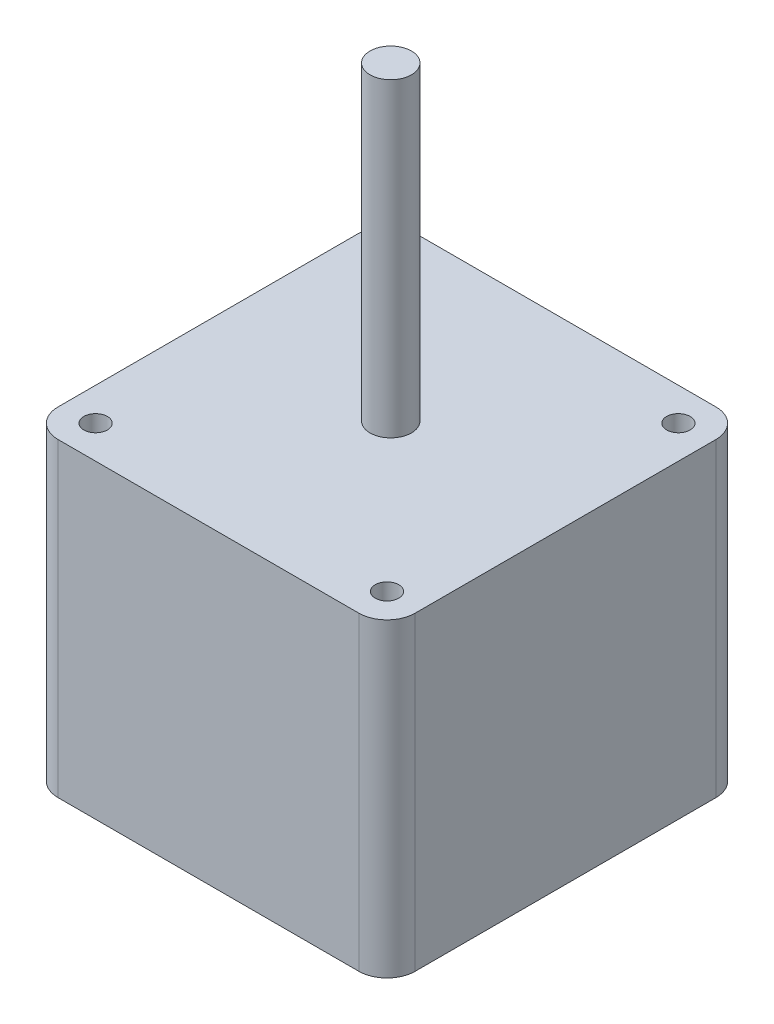
ISO-10303-21;
HEADER;
FILE_DESCRIPTION(('STEP AP214'),'2;1');
FILE_NAME('part.step','',(''),(''),'','','');
FILE_SCHEMA(('AUTOMOTIVE_DESIGN { 1 0 10303 214 1 1 1 1 }'));
ENDSEC;
DATA;
#1=APPLICATION_CONTEXT('core data for automotive mechanical design processes');
#2=APPLICATION_PROTOCOL_DEFINITION('international standard','automotive_design',2000,#1);
#3=PRODUCT_CONTEXT('',#1,'mechanical');
#4=PRODUCT('Part','Part','',(#3));
#5=PRODUCT_RELATED_PRODUCT_CATEGORY('part','',(#4));
#6=PRODUCT_DEFINITION_FORMATION('','',#4);
#7=PRODUCT_DEFINITION_CONTEXT('part definition',#1,'design');
#8=PRODUCT_DEFINITION('design','',#6,#7);
#9=PRODUCT_DEFINITION_SHAPE('','',#8);
#10=(LENGTH_UNIT() NAMED_UNIT(*) SI_UNIT(.MILLI.,.METRE.));
#11=(NAMED_UNIT(*) PLANE_ANGLE_UNIT() SI_UNIT($,.RADIAN.));
#12=(NAMED_UNIT(*) SI_UNIT($,.STERADIAN.) SOLID_ANGLE_UNIT());
#13=UNCERTAINTY_MEASURE_WITH_UNIT(LENGTH_MEASURE(1.E-05),#10,'distance_accuracy_value','');
#14=(GEOMETRIC_REPRESENTATION_CONTEXT(3) GLOBAL_UNCERTAINTY_ASSIGNED_CONTEXT((#13)) GLOBAL_UNIT_ASSIGNED_CONTEXT((#10,
#11,#12)) REPRESENTATION_CONTEXT('',''));
#15=CARTESIAN_POINT('',(0.,0.,0.));
#16=DIRECTION('',(0.,0.,1.));
#17=DIRECTION('',(1.,0.,0.));
#18=AXIS2_PLACEMENT_3D('',#15,#16,#17);
#19=CARTESIAN_POINT('',(0.,33.,0.));
#20=DIRECTION('',(0.,1.,0.));
#21=DIRECTION('',(0.,0.,1.));
#22=AXIS2_PLACEMENT_3D('',#19,#20,#21);
#23=PLANE('',#22);
#24=CARTESIAN_POINT('',(3.50000000000002,33.,-3.49999999999999));
#25=DIRECTION('',(0.,-1.,0.));
#26=DIRECTION('',(0.,0.,-1.));
#27=AXIS2_PLACEMENT_3D('',#24,#25,#26);
#28=CIRCLE('',#27,1.25);
#29=CARTESIAN_POINT('',(3.50000000000002,33.,-2.24999999999999));
#30=VERTEX_POINT('',#29);
#31=EDGE_CURVE('E198',#30,#30,#28,.T.);
#32=ORIENTED_EDGE('',*,*,#31,.T.);
#33=EDGE_LOOP('',(#32));
#34=FACE_BOUND('',#33,.T.);
#35=CARTESIAN_POINT('',(34.5,33.,-3.49999999999996));
#36=DIRECTION('',(0.,1.,0.));
#37=DIRECTION('',(0.,0.,1.));
#38=AXIS2_PLACEMENT_3D('',#35,#36,#37);
#39=CIRCLE('',#38,1.25);
#40=CARTESIAN_POINT('',(34.5,33.,-2.24999999999996));
#41=VERTEX_POINT('',#40);
#42=EDGE_CURVE('E199',#41,#41,#39,.T.);
#43=ORIENTED_EDGE('',*,*,#42,.F.);
#44=EDGE_LOOP('',(#43));
#45=FACE_BOUND('',#44,.T.);
#46=CARTESIAN_POINT('',(3.50000000000002,33.,-34.5));
#47=DIRECTION('',(0.,1.,0.));
#48=DIRECTION('',(0.,0.,1.));
#49=AXIS2_PLACEMENT_3D('',#46,#47,#48);
#50=CIRCLE('',#49,1.25);
#51=CARTESIAN_POINT('',(3.50000000000002,33.,-33.25));
#52=VERTEX_POINT('',#51);
#53=EDGE_CURVE('E189',#52,#52,#50,.T.);
#54=ORIENTED_EDGE('',*,*,#53,.F.);
#55=EDGE_LOOP('',(#54));
#56=FACE_BOUND('',#55,.T.);
#57=CARTESIAN_POINT('',(19.,33.,-19.3988477754858));
#58=DIRECTION('',(0.,1.,0.));
#59=DIRECTION('',(0.,0.,1.));
#60=AXIS2_PLACEMENT_3D('',#57,#58,#59);
#61=CIRCLE('',#60,2.2);
#62=CARTESIAN_POINT('',(19.,33.,-17.1988477754858));
#63=VERTEX_POINT('',#62);
#64=EDGE_CURVE('E139',#63,#63,#61,.T.);
#65=ORIENTED_EDGE('',*,*,#64,.F.);
#66=EDGE_LOOP('',(#65));
#67=FACE_BOUND('',#66,.T.);
#68=DIRECTION('',(0.,0.,-1.));
#69=VECTOR('',#68,1.);
#70=CARTESIAN_POINT('',(38.,33.,0.));
#71=LINE('',#70,#69);
#72=CARTESIAN_POINT('',(38.,33.,-3.));
#73=VERTEX_POINT('',#72);
#74=CARTESIAN_POINT('',(38.,33.,-35.));
#75=VERTEX_POINT('',#74);
#76=EDGE_CURVE('E142',#73,#75,#71,.T.);
#77=ORIENTED_EDGE('',*,*,#76,.T.);
#78=CARTESIAN_POINT('',(35.,33.,-35.));
#79=DIRECTION('',(0.,1.,0.));
#80=DIRECTION('',(0.,0.,1.));
#81=AXIS2_PLACEMENT_3D('',#78,#79,#80);
#82=CIRCLE('',#81,3.);
#83=CARTESIAN_POINT('',(35.,33.,-38.));
#84=VERTEX_POINT('',#83);
#85=EDGE_CURVE('E161',#75,#84,#82,.T.);
#86=ORIENTED_EDGE('',*,*,#85,.T.);
#87=DIRECTION('',(-1.,0.,0.));
#88=VECTOR('',#87,1.);
#89=CARTESIAN_POINT('',(38.,33.,-38.));
#90=LINE('',#89,#88);
#91=CARTESIAN_POINT('',(3.00000000000004,33.,-38.));
#92=VERTEX_POINT('',#91);
#93=EDGE_CURVE('E126',#84,#92,#90,.T.);
#94=ORIENTED_EDGE('',*,*,#93,.T.);
#95=CARTESIAN_POINT('',(3.00000000000004,33.,-35.));
#96=DIRECTION('',(0.,1.,0.));
#97=DIRECTION('',(0.,0.,1.));
#98=AXIS2_PLACEMENT_3D('',#95,#96,#97);
#99=CIRCLE('',#98,3.);
#100=CARTESIAN_POINT('',(0.,33.,-35.));
#101=VERTEX_POINT('',#100);
#102=EDGE_CURVE('E156',#92,#101,#99,.T.);
#103=ORIENTED_EDGE('',*,*,#102,.T.);
#104=DIRECTION('',(0.,0.,1.));
#105=VECTOR('',#104,1.);
#106=CARTESIAN_POINT('',(0.,33.,-38.));
#107=LINE('',#106,#105);
#108=CARTESIAN_POINT('',(0.,33.,-3.));
#109=VERTEX_POINT('',#108);
#110=EDGE_CURVE('E172',#101,#109,#107,.T.);
#111=ORIENTED_EDGE('',*,*,#110,.T.);
#112=CARTESIAN_POINT('',(3.,33.,-3.));
#113=DIRECTION('',(0.,1.,0.));
#114=DIRECTION('',(0.,0.,1.));
#115=AXIS2_PLACEMENT_3D('',#112,#113,#114);
#116=CIRCLE('',#115,3.);
#117=CARTESIAN_POINT('',(3.,33.,0.));
#118=VERTEX_POINT('',#117);
#119=EDGE_CURVE('E62',#109,#118,#116,.T.);
#120=ORIENTED_EDGE('',*,*,#119,.T.);
#121=DIRECTION('',(1.,0.,0.));
#122=VECTOR('',#121,1.);
#123=CARTESIAN_POINT('',(0.,33.,0.));
#124=LINE('',#123,#122);
#125=CARTESIAN_POINT('',(35.,33.,0.));
#126=VERTEX_POINT('',#125);
#127=EDGE_CURVE('E180',#118,#126,#124,.T.);
#128=ORIENTED_EDGE('',*,*,#127,.T.);
#129=CARTESIAN_POINT('',(35.,33.,-3.));
#130=DIRECTION('',(0.,1.,0.));
#131=DIRECTION('',(0.,0.,1.));
#132=AXIS2_PLACEMENT_3D('',#129,#130,#131);
#133=CIRCLE('',#132,3.);
#134=EDGE_CURVE('E159',#126,#73,#133,.T.);
#135=ORIENTED_EDGE('',*,*,#134,.T.);
#136=EDGE_LOOP('',(#77,#86,#94,#103,#111,#120,#128,#135));
#137=FACE_BOUND('',#136,.T.);
#138=CARTESIAN_POINT('',(34.5,33.,-34.5));
#139=DIRECTION('',(0.,-1.,0.));
#140=DIRECTION('',(0.,0.,-1.));
#141=AXIS2_PLACEMENT_3D('',#138,#139,#140);
#142=CIRCLE('',#141,1.25);
#143=CARTESIAN_POINT('',(34.5,33.,-33.25));
#144=VERTEX_POINT('',#143);
#145=EDGE_CURVE('E192',#144,#144,#142,.T.);
#146=ORIENTED_EDGE('',*,*,#145,.T.);
#147=EDGE_LOOP('',(#146));
#148=FACE_BOUND('',#147,.T.);
#149=ADVANCED_FACE('F40',(#34,#45,#56,#67,#137,#148),#23,.T.);
#150=CARTESIAN_POINT('',(38.,33.,-38.));
#151=DIRECTION('',(0.,0.,1.));
#152=DIRECTION('',(1.,0.,0.));
#153=AXIS2_PLACEMENT_3D('',#150,#151,#152);
#154=PLANE('',#153);
#155=ORIENTED_EDGE('',*,*,#93,.F.);
#156=DIRECTION('',(0.,-1.,0.));
#157=VECTOR('',#156,1.);
#158=CARTESIAN_POINT('',(35.,33.,-38.));
#159=LINE('',#158,#157);
#160=CARTESIAN_POINT('',(35.,0.,-38.));
#161=VERTEX_POINT('',#160);
#162=EDGE_CURVE('E110',#84,#161,#159,.T.);
#163=ORIENTED_EDGE('',*,*,#162,.T.);
#164=DIRECTION('',(-1.,0.,0.));
#165=VECTOR('',#164,1.);
#166=CARTESIAN_POINT('',(38.,0.,-38.));
#167=LINE('',#166,#165);
#168=CARTESIAN_POINT('',(3.00000000000004,0.,-38.));
#169=VERTEX_POINT('',#168);
#170=EDGE_CURVE('E123',#161,#169,#167,.T.);
#171=ORIENTED_EDGE('',*,*,#170,.T.);
#172=DIRECTION('',(0.,-1.,0.));
#173=VECTOR('',#172,1.);
#174=CARTESIAN_POINT('',(3.00000000000004,33.,-38.));
#175=LINE('',#174,#173);
#176=EDGE_CURVE('E128',#169,#92,#175,.F.);
#177=ORIENTED_EDGE('',*,*,#176,.T.);
#178=EDGE_LOOP('',(#155,#163,#171,#177));
#179=FACE_BOUND('',#178,.T.);
#180=ADVANCED_FACE('F122',(#179),#154,.F.);
#181=CARTESIAN_POINT('',(0.,33.,-38.));
#182=DIRECTION('',(1.,0.,0.));
#183=DIRECTION('',(0.,0.,-1.));
#184=AXIS2_PLACEMENT_3D('',#181,#182,#183);
#185=PLANE('',#184);
#186=DIRECTION('',(0.,0.,1.));
#187=VECTOR('',#186,1.);
#188=CARTESIAN_POINT('',(0.,0.,-38.));
#189=LINE('',#188,#187);
#190=CARTESIAN_POINT('',(0.,0.,-35.));
#191=VERTEX_POINT('',#190);
#192=CARTESIAN_POINT('',(0.,0.,-3.));
#193=VERTEX_POINT('',#192);
#194=EDGE_CURVE('E132',#191,#193,#189,.T.);
#195=ORIENTED_EDGE('',*,*,#194,.T.);
#196=DIRECTION('',(0.,-1.,0.));
#197=VECTOR('',#196,1.);
#198=CARTESIAN_POINT('',(0.,33.,-3.));
#199=LINE('',#198,#197);
#200=EDGE_CURVE('E11',#193,#109,#199,.F.);
#201=ORIENTED_EDGE('',*,*,#200,.T.);
#202=ORIENTED_EDGE('',*,*,#110,.F.);
#203=DIRECTION('',(0.,-1.,0.));
#204=VECTOR('',#203,1.);
#205=CARTESIAN_POINT('',(0.,33.,-35.));
#206=LINE('',#205,#204);
#207=EDGE_CURVE('E48',#101,#191,#206,.T.);
#208=ORIENTED_EDGE('',*,*,#207,.T.);
#209=EDGE_LOOP('',(#195,#201,#202,#208));
#210=FACE_BOUND('',#209,.T.);
#211=ADVANCED_FACE('F170',(#210),#185,.F.);
#212=CARTESIAN_POINT('',(0.,33.,0.));
#213=DIRECTION('',(0.,0.,-1.));
#214=DIRECTION('',(-1.,0.,0.));
#215=AXIS2_PLACEMENT_3D('',#212,#213,#214);
#216=PLANE('',#215);
#217=DIRECTION('',(1.,0.,0.));
#218=VECTOR('',#217,1.);
#219=CARTESIAN_POINT('',(0.,0.,0.));
#220=LINE('',#219,#218);
#221=CARTESIAN_POINT('',(3.,0.,0.));
#222=VERTEX_POINT('',#221);
#223=CARTESIAN_POINT('',(35.,0.,0.));
#224=VERTEX_POINT('',#223);
#225=EDGE_CURVE('E136',#222,#224,#220,.T.);
#226=ORIENTED_EDGE('',*,*,#225,.T.);
#227=DIRECTION('',(0.,-1.,0.));
#228=VECTOR('',#227,1.);
#229=CARTESIAN_POINT('',(35.,33.,0.));
#230=LINE('',#229,#228);
#231=EDGE_CURVE('E55',#224,#126,#230,.F.);
#232=ORIENTED_EDGE('',*,*,#231,.T.);
#233=ORIENTED_EDGE('',*,*,#127,.F.);
#234=DIRECTION('',(0.,-1.,0.));
#235=VECTOR('',#234,1.);
#236=CARTESIAN_POINT('',(3.,33.,0.));
#237=LINE('',#236,#235);
#238=EDGE_CURVE('E163',#118,#222,#237,.T.);
#239=ORIENTED_EDGE('',*,*,#238,.T.);
#240=EDGE_LOOP('',(#226,#232,#233,#239));
#241=FACE_BOUND('',#240,.T.);
#242=ADVANCED_FACE('F179',(#241),#216,.F.);
#243=CARTESIAN_POINT('',(38.,33.,0.));
#244=DIRECTION('',(-1.,0.,0.));
#245=DIRECTION('',(0.,0.,1.));
#246=AXIS2_PLACEMENT_3D('',#243,#244,#245);
#247=PLANE('',#246);
#248=DIRECTION('',(0.,0.,-1.));
#249=VECTOR('',#248,1.);
#250=CARTESIAN_POINT('',(38.,0.,0.));
#251=LINE('',#250,#249);
#252=CARTESIAN_POINT('',(38.,0.,-3.));
#253=VERTEX_POINT('',#252);
#254=CARTESIAN_POINT('',(38.,0.,-35.));
#255=VERTEX_POINT('',#254);
#256=EDGE_CURVE('E146',#253,#255,#251,.T.);
#257=ORIENTED_EDGE('',*,*,#256,.T.);
#258=DIRECTION('',(0.,-1.,0.));
#259=VECTOR('',#258,1.);
#260=CARTESIAN_POINT('',(38.,33.,-35.));
#261=LINE('',#260,#259);
#262=EDGE_CURVE('E111',#255,#75,#261,.F.);
#263=ORIENTED_EDGE('',*,*,#262,.T.);
#264=ORIENTED_EDGE('',*,*,#76,.F.);
#265=DIRECTION('',(0.,-1.,0.));
#266=VECTOR('',#265,1.);
#267=CARTESIAN_POINT('',(38.,33.,-3.));
#268=LINE('',#267,#266);
#269=EDGE_CURVE('E116',#73,#253,#268,.T.);
#270=ORIENTED_EDGE('',*,*,#269,.T.);
#271=EDGE_LOOP('',(#257,#263,#264,#270));
#272=FACE_BOUND('',#271,.T.);
#273=ADVANCED_FACE('F266',(#272),#247,.F.);
#274=CARTESIAN_POINT('',(0.,0.,0.));
#275=DIRECTION('',(0.,1.,0.));
#276=DIRECTION('',(0.,0.,1.));
#277=AXIS2_PLACEMENT_3D('',#274,#275,#276);
#278=PLANE('',#277);
#279=ORIENTED_EDGE('',*,*,#170,.F.);
#280=CARTESIAN_POINT('',(35.,0.,-35.));
#281=DIRECTION('',(0.,1.,0.));
#282=DIRECTION('',(0.,0.,1.));
#283=AXIS2_PLACEMENT_3D('',#280,#281,#282);
#284=CIRCLE('',#283,3.);
#285=EDGE_CURVE('E106',#161,#255,#284,.F.);
#286=ORIENTED_EDGE('',*,*,#285,.T.);
#287=ORIENTED_EDGE('',*,*,#256,.F.);
#288=CARTESIAN_POINT('',(35.,0.,-3.));
#289=DIRECTION('',(0.,1.,0.));
#290=DIRECTION('',(0.,0.,1.));
#291=AXIS2_PLACEMENT_3D('',#288,#289,#290);
#292=CIRCLE('',#291,3.);
#293=EDGE_CURVE('E117',#253,#224,#292,.F.);
#294=ORIENTED_EDGE('',*,*,#293,.T.);
#295=ORIENTED_EDGE('',*,*,#225,.F.);
#296=CARTESIAN_POINT('',(3.,0.,-3.));
#297=DIRECTION('',(0.,1.,0.));
#298=DIRECTION('',(0.,0.,1.));
#299=AXIS2_PLACEMENT_3D('',#296,#297,#298);
#300=CIRCLE('',#299,3.);
#301=EDGE_CURVE('E150',#222,#193,#300,.F.);
#302=ORIENTED_EDGE('',*,*,#301,.T.);
#303=ORIENTED_EDGE('',*,*,#194,.F.);
#304=CARTESIAN_POINT('',(3.00000000000004,0.,-35.));
#305=DIRECTION('',(0.,1.,0.));
#306=DIRECTION('',(0.,0.,1.));
#307=AXIS2_PLACEMENT_3D('',#304,#305,#306);
#308=CIRCLE('',#307,3.);
#309=EDGE_CURVE('E127',#191,#169,#308,.F.);
#310=ORIENTED_EDGE('',*,*,#309,.T.);
#311=EDGE_LOOP('',(#279,#286,#287,#294,#295,#302,#303,#310));
#312=FACE_BOUND('',#311,.T.);
#313=ADVANCED_FACE('F130',(#312),#278,.F.);
#314=CARTESIAN_POINT('',(19.,66.,-19.3988477754858));
#315=DIRECTION('',(0.,-1.,0.));
#316=DIRECTION('',(0.,0.,-1.));
#317=AXIS2_PLACEMENT_3D('',#314,#315,#316);
#318=CYLINDRICAL_SURFACE('',#317,2.2);
#319=CARTESIAN_POINT('',(19.,66.,-19.3988477754858));
#320=DIRECTION('',(0.,1.,0.));
#321=DIRECTION('',(0.,0.,1.));
#322=AXIS2_PLACEMENT_3D('',#319,#320,#321);
#323=CIRCLE('',#322,2.2);
#324=CARTESIAN_POINT('',(19.,66.,-17.1988477754858));
#325=VERTEX_POINT('',#324);
#326=EDGE_CURVE('E133',#325,#325,#323,.T.);
#327=ORIENTED_EDGE('',*,*,#326,.F.);
#328=EDGE_LOOP('',(#327));
#329=FACE_BOUND('',#328,.T.);
#330=ORIENTED_EDGE('',*,*,#64,.T.);
#331=EDGE_LOOP('',(#330));
#332=FACE_BOUND('',#331,.T.);
#333=ADVANCED_FACE('F259',(#329,#332),#318,.T.);
#334=CARTESIAN_POINT('',(19.,66.,-19.3988477754858));
#335=DIRECTION('',(0.,1.,0.));
#336=DIRECTION('',(0.,0.,1.));
#337=AXIS2_PLACEMENT_3D('',#334,#335,#336);
#338=PLANE('',#337);
#339=ORIENTED_EDGE('',*,*,#326,.T.);
#340=EDGE_LOOP('',(#339));
#341=FACE_BOUND('',#340,.T.);
#342=ADVANCED_FACE('F256',(#341),#338,.T.);
#343=CARTESIAN_POINT('',(35.,33.,-35.));
#344=DIRECTION('',(0.,-1.,0.));
#345=DIRECTION('',(0.,0.,-1.));
#346=AXIS2_PLACEMENT_3D('',#343,#344,#345);
#347=CYLINDRICAL_SURFACE('',#346,3.);
#348=ORIENTED_EDGE('',*,*,#85,.F.);
#349=ORIENTED_EDGE('',*,*,#262,.F.);
#350=ORIENTED_EDGE('',*,*,#285,.F.);
#351=ORIENTED_EDGE('',*,*,#162,.F.);
#352=EDGE_LOOP('',(#348,#349,#350,#351));
#353=FACE_BOUND('',#352,.T.);
#354=ADVANCED_FACE('F109',(#353),#347,.T.);
#355=CARTESIAN_POINT('',(35.,33.,-3.));
#356=DIRECTION('',(0.,-1.,0.));
#357=DIRECTION('',(0.,0.,-1.));
#358=AXIS2_PLACEMENT_3D('',#355,#356,#357);
#359=CYLINDRICAL_SURFACE('',#358,3.);
#360=ORIENTED_EDGE('',*,*,#134,.F.);
#361=ORIENTED_EDGE('',*,*,#231,.F.);
#362=ORIENTED_EDGE('',*,*,#293,.F.);
#363=ORIENTED_EDGE('',*,*,#269,.F.);
#364=EDGE_LOOP('',(#360,#361,#362,#363));
#365=FACE_BOUND('',#364,.T.);
#366=ADVANCED_FACE('F278',(#365),#359,.T.);
#367=CARTESIAN_POINT('',(3.,33.,-3.));
#368=DIRECTION('',(0.,-1.,0.));
#369=DIRECTION('',(0.,0.,-1.));
#370=AXIS2_PLACEMENT_3D('',#367,#368,#369);
#371=CYLINDRICAL_SURFACE('',#370,3.);
#372=ORIENTED_EDGE('',*,*,#119,.F.);
#373=ORIENTED_EDGE('',*,*,#200,.F.);
#374=ORIENTED_EDGE('',*,*,#301,.F.);
#375=ORIENTED_EDGE('',*,*,#238,.F.);
#376=EDGE_LOOP('',(#372,#373,#374,#375));
#377=FACE_BOUND('',#376,.T.);
#378=ADVANCED_FACE('F178',(#377),#371,.T.);
#379=CARTESIAN_POINT('',(3.00000000000004,33.,-35.));
#380=DIRECTION('',(0.,-1.,0.));
#381=DIRECTION('',(0.,0.,-1.));
#382=AXIS2_PLACEMENT_3D('',#379,#380,#381);
#383=CYLINDRICAL_SURFACE('',#382,3.);
#384=ORIENTED_EDGE('',*,*,#102,.F.);
#385=ORIENTED_EDGE('',*,*,#176,.F.);
#386=ORIENTED_EDGE('',*,*,#309,.F.);
#387=ORIENTED_EDGE('',*,*,#207,.F.);
#388=EDGE_LOOP('',(#384,#385,#386,#387));
#389=FACE_BOUND('',#388,.T.);
#390=ADVANCED_FACE('F42',(#389),#383,.T.);
#391=CARTESIAN_POINT('',(3.50000000000002,26.,-34.5));
#392=DIRECTION('',(0.,1.,0.));
#393=DIRECTION('',(0.,0.,1.));
#394=AXIS2_PLACEMENT_3D('',#391,#392,#393);
#395=CYLINDRICAL_SURFACE('',#394,1.25);
#396=CARTESIAN_POINT('',(3.50000000000002,26.,-34.5));
#397=DIRECTION('',(0.,1.,0.));
#398=DIRECTION('',(0.,0.,1.));
#399=AXIS2_PLACEMENT_3D('',#396,#397,#398);
#400=CIRCLE('',#399,1.25);
#401=CARTESIAN_POINT('',(3.50000000000002,26.,-33.25));
#402=VERTEX_POINT('',#401);
#403=EDGE_CURVE('E187',#402,#402,#400,.T.);
#404=CARTESIAN_POINT('',(3.50000000000002,26.,-33.25));
#405=CARTESIAN_POINT('',(3.50000000000002,26.0729166666667,-33.25));
#406=CARTESIAN_POINT('',(3.50000000000002,26.1458333333333,-33.25));
#407=CARTESIAN_POINT('',(3.50000000000002,26.2916666666667,-33.25));
#408=CARTESIAN_POINT('',(3.50000000000002,26.3645833333333,-33.25));
#409=CARTESIAN_POINT('',(3.50000000000002,26.5104166666667,-33.25));
#410=CARTESIAN_POINT('',(3.50000000000002,26.5833333333333,-33.25));
#411=CARTESIAN_POINT('',(3.50000000000002,26.7291666666667,-33.25));
#412=CARTESIAN_POINT('',(3.50000000000002,26.8020833333333,-33.25));
#413=CARTESIAN_POINT('',(3.50000000000002,26.9479166666667,-33.25));
#414=CARTESIAN_POINT('',(3.50000000000002,27.0208333333333,-33.25));
#415=CARTESIAN_POINT('',(3.50000000000002,27.1666666666667,-33.25));
#416=CARTESIAN_POINT('',(3.50000000000002,27.2395833333333,-33.25));
#417=CARTESIAN_POINT('',(3.50000000000002,27.3854166666667,-33.25));
#418=CARTESIAN_POINT('',(3.50000000000002,27.4583333333333,-33.25));
#419=CARTESIAN_POINT('',(3.50000000000002,27.6041666666667,-33.25));
#420=CARTESIAN_POINT('',(3.50000000000002,27.6770833333333,-33.25));
#421=CARTESIAN_POINT('',(3.50000000000002,27.8229166666667,-33.25));
#422=CARTESIAN_POINT('',(3.50000000000002,27.8958333333333,-33.25));
#423=CARTESIAN_POINT('',(3.50000000000002,28.0416666666667,-33.25));
#424=CARTESIAN_POINT('',(3.50000000000002,28.1145833333333,-33.25));
#425=CARTESIAN_POINT('',(3.50000000000002,28.2604166666667,-33.25));
#426=CARTESIAN_POINT('',(3.50000000000002,28.3333333333333,-33.25));
#427=CARTESIAN_POINT('',(3.50000000000002,28.4791666666667,-33.25));
#428=CARTESIAN_POINT('',(3.50000000000002,28.5520833333333,-33.25));
#429=CARTESIAN_POINT('',(3.50000000000002,28.6979166666667,-33.25));
#430=CARTESIAN_POINT('',(3.50000000000002,28.7708333333333,-33.25));
#431=CARTESIAN_POINT('',(3.50000000000002,28.9166666666667,-33.25));
#432=CARTESIAN_POINT('',(3.50000000000002,28.9895833333333,-33.25));
#433=CARTESIAN_POINT('',(3.50000000000002,29.1354166666667,-33.25));
#434=CARTESIAN_POINT('',(3.50000000000002,29.2083333333333,-33.25));
#435=CARTESIAN_POINT('',(3.50000000000002,29.3541666666667,-33.25));
#436=CARTESIAN_POINT('',(3.50000000000002,29.4270833333333,-33.25));
#437=CARTESIAN_POINT('',(3.50000000000002,29.5729166666667,-33.25));
#438=CARTESIAN_POINT('',(3.50000000000002,29.6458333333333,-33.25));
#439=CARTESIAN_POINT('',(3.50000000000002,29.7916666666667,-33.25));
#440=CARTESIAN_POINT('',(3.50000000000002,29.8645833333333,-33.25));
#441=CARTESIAN_POINT('',(3.50000000000002,30.0104166666667,-33.25));
#442=CARTESIAN_POINT('',(3.50000000000002,30.0833333333333,-33.25));
#443=CARTESIAN_POINT('',(3.50000000000002,30.2291666666667,-33.25));
#444=CARTESIAN_POINT('',(3.50000000000002,30.3020833333333,-33.25));
#445=CARTESIAN_POINT('',(3.50000000000002,30.4479166666667,-33.25));
#446=CARTESIAN_POINT('',(3.50000000000002,30.5208333333333,-33.25));
#447=CARTESIAN_POINT('',(3.50000000000002,30.6666666666667,-33.25));
#448=CARTESIAN_POINT('',(3.50000000000002,30.7395833333333,-33.25));
#449=CARTESIAN_POINT('',(3.50000000000002,30.8854166666667,-33.25));
#450=CARTESIAN_POINT('',(3.50000000000002,30.9583333333333,-33.25));
#451=CARTESIAN_POINT('',(3.50000000000002,31.1041666666667,-33.25));
#452=CARTESIAN_POINT('',(3.50000000000002,31.1770833333333,-33.25));
#453=CARTESIAN_POINT('',(3.50000000000002,31.3229166666667,-33.25));
#454=CARTESIAN_POINT('',(3.50000000000002,31.3958333333333,-33.25));
#455=CARTESIAN_POINT('',(3.50000000000002,31.5416666666667,-33.25));
#456=CARTESIAN_POINT('',(3.50000000000002,31.6145833333333,-33.25));
#457=CARTESIAN_POINT('',(3.50000000000002,31.7604166666667,-33.25));
#458=CARTESIAN_POINT('',(3.50000000000002,31.8333333333333,-33.25));
#459=CARTESIAN_POINT('',(3.50000000000002,31.9791666666667,-33.25));
#460=CARTESIAN_POINT('',(3.50000000000002,32.0520833333333,-33.25));
#461=CARTESIAN_POINT('',(3.50000000000002,32.1979166666667,-33.25));
#462=CARTESIAN_POINT('',(3.50000000000002,32.2708333333333,-33.25));
#463=CARTESIAN_POINT('',(3.50000000000002,32.4166666666667,-33.25));
#464=CARTESIAN_POINT('',(3.50000000000002,32.4895833333333,-33.25));
#465=CARTESIAN_POINT('',(3.50000000000002,32.6354166666667,-33.25));
#466=CARTESIAN_POINT('',(3.50000000000002,32.7083333333333,-33.25));
#467=CARTESIAN_POINT('',(3.50000000000002,32.8541666666667,-33.25));
#468=CARTESIAN_POINT('',(3.50000000000002,32.9270833333333,-33.25));
#469=CARTESIAN_POINT('',(3.50000000000002,33.,-33.25));
#470=B_SPLINE_CURVE_WITH_KNOTS('',3,(#404,#405,#406,#407,#408,#409,#410,#411,#412,#413,#414,
#415,#416,#417,#418,#419,#420,#421,#422,#423,#424,#425,#426,#427,#428,#429,#430,#431,#432,#433,
#434,#435,#436,#437,#438,#439,#440,#441,#442,#443,#444,#445,#446,#447,#448,#449,#450,#451,#452,
#453,#454,#455,#456,#457,#458,#459,#460,#461,#462,#463,#464,#465,#466,#467,#468,#469),
.UNSPECIFIED.,.F.,.F.,(4,2,2,2,2,2,2,2,2,2,2,2,2,2,2,2,2,2,2,2,2,2,2,2,2,2,2,2,2,2,2,2,4),(0.,
0.21875,0.4375,0.656250000000001,0.875000000000001,1.09375,1.3125,1.53125,1.75,1.96875,2.1875,
2.40625,2.625,2.84375,3.0625,3.28125,3.5,3.71875,3.9375,4.15625,4.375,4.59375,4.8125,5.03125,
5.25,5.46875,5.6875,5.90625,6.125,6.34375,6.5625,6.78125,7.),.UNSPECIFIED.);
#471=EDGE_CURVE('BSEAM251',#402,#52,#470,.T.);
#472=ORIENTED_EDGE('',*,*,#403,.F.);
#473=ORIENTED_EDGE('',*,*,#53,.T.);
#474=ORIENTED_EDGE('',*,*,#471,.T.);
#475=ORIENTED_EDGE('',*,*,#471,.F.);
#476=EDGE_LOOP('',(#472,#474,#473,#475));
#477=FACE_BOUND('',#476,.T.);
#478=ADVANCED_FACE('F251',(#477),#395,.F.);
#479=CARTESIAN_POINT('',(3.50000000000002,26.,-34.5));
#480=DIRECTION('',(0.,1.,0.));
#481=DIRECTION('',(0.,0.,1.));
#482=AXIS2_PLACEMENT_3D('',#479,#480,#481);
#483=PLANE('',#482);
#484=ORIENTED_EDGE('',*,*,#403,.T.);
#485=EDGE_LOOP('',(#484));
#486=FACE_BOUND('',#485,.T.);
#487=ADVANCED_FACE('F248',(#486),#483,.T.);
#488=CARTESIAN_POINT('',(34.5,26.,-3.49999999999996));
#489=DIRECTION('',(0.,1.,0.));
#490=DIRECTION('',(0.,0.,1.));
#491=AXIS2_PLACEMENT_3D('',#488,#489,#490);
#492=CYLINDRICAL_SURFACE('',#491,1.25);
#493=CARTESIAN_POINT('',(34.5,26.,-3.49999999999996));
#494=DIRECTION('',(0.,1.,0.));
#495=DIRECTION('',(0.,0.,1.));
#496=AXIS2_PLACEMENT_3D('',#493,#494,#495);
#497=CIRCLE('',#496,1.25);
#498=CARTESIAN_POINT('',(34.5,26.,-2.24999999999996));
#499=VERTEX_POINT('',#498);
#500=EDGE_CURVE('E207',#499,#499,#497,.T.);
#501=CARTESIAN_POINT('',(34.5,26.,-2.24999999999996));
#502=CARTESIAN_POINT('',(34.5,26.0729166666667,-2.24999999999996));
#503=CARTESIAN_POINT('',(34.5,26.1458333333333,-2.24999999999996));
#504=CARTESIAN_POINT('',(34.5,26.2916666666667,-2.24999999999996));
#505=CARTESIAN_POINT('',(34.5,26.3645833333333,-2.24999999999996));
#506=CARTESIAN_POINT('',(34.5,26.5104166666667,-2.24999999999996));
#507=CARTESIAN_POINT('',(34.5,26.5833333333333,-2.24999999999996));
#508=CARTESIAN_POINT('',(34.5,26.7291666666667,-2.24999999999996));
#509=CARTESIAN_POINT('',(34.5,26.8020833333333,-2.24999999999996));
#510=CARTESIAN_POINT('',(34.5,26.9479166666667,-2.24999999999996));
#511=CARTESIAN_POINT('',(34.5,27.0208333333333,-2.24999999999996));
#512=CARTESIAN_POINT('',(34.5,27.1666666666667,-2.24999999999996));
#513=CARTESIAN_POINT('',(34.5,27.2395833333333,-2.24999999999996));
#514=CARTESIAN_POINT('',(34.5,27.3854166666667,-2.24999999999996));
#515=CARTESIAN_POINT('',(34.5,27.4583333333333,-2.24999999999996));
#516=CARTESIAN_POINT('',(34.5,27.6041666666667,-2.24999999999996));
#517=CARTESIAN_POINT('',(34.5,27.6770833333333,-2.24999999999996));
#518=CARTESIAN_POINT('',(34.5,27.8229166666667,-2.24999999999996));
#519=CARTESIAN_POINT('',(34.5,27.8958333333333,-2.24999999999996));
#520=CARTESIAN_POINT('',(34.5,28.0416666666667,-2.24999999999996));
#521=CARTESIAN_POINT('',(34.5,28.1145833333333,-2.24999999999996));
#522=CARTESIAN_POINT('',(34.5,28.2604166666667,-2.24999999999996));
#523=CARTESIAN_POINT('',(34.5,28.3333333333333,-2.24999999999996));
#524=CARTESIAN_POINT('',(34.5,28.4791666666667,-2.24999999999996));
#525=CARTESIAN_POINT('',(34.5,28.5520833333333,-2.24999999999996));
#526=CARTESIAN_POINT('',(34.5,28.6979166666667,-2.24999999999996));
#527=CARTESIAN_POINT('',(34.5,28.7708333333333,-2.24999999999996));
#528=CARTESIAN_POINT('',(34.5,28.9166666666667,-2.24999999999996));
#529=CARTESIAN_POINT('',(34.5,28.9895833333333,-2.24999999999996));
#530=CARTESIAN_POINT('',(34.5,29.1354166666667,-2.24999999999996));
#531=CARTESIAN_POINT('',(34.5,29.2083333333333,-2.24999999999996));
#532=CARTESIAN_POINT('',(34.5,29.3541666666667,-2.24999999999996));
#533=CARTESIAN_POINT('',(34.5,29.4270833333333,-2.24999999999996));
#534=CARTESIAN_POINT('',(34.5,29.5729166666667,-2.24999999999996));
#535=CARTESIAN_POINT('',(34.5,29.6458333333333,-2.24999999999996));
#536=CARTESIAN_POINT('',(34.5,29.7916666666667,-2.24999999999996));
#537=CARTESIAN_POINT('',(34.5,29.8645833333333,-2.24999999999996));
#538=CARTESIAN_POINT('',(34.5,30.0104166666667,-2.24999999999996));
#539=CARTESIAN_POINT('',(34.5,30.0833333333333,-2.24999999999996));
#540=CARTESIAN_POINT('',(34.5,30.2291666666667,-2.24999999999996));
#541=CARTESIAN_POINT('',(34.5,30.3020833333333,-2.24999999999996));
#542=CARTESIAN_POINT('',(34.5,30.4479166666667,-2.24999999999996));
#543=CARTESIAN_POINT('',(34.5,30.5208333333333,-2.24999999999996));
#544=CARTESIAN_POINT('',(34.5,30.6666666666667,-2.24999999999996));
#545=CARTESIAN_POINT('',(34.5,30.7395833333333,-2.24999999999996));
#546=CARTESIAN_POINT('',(34.5,30.8854166666667,-2.24999999999996));
#547=CARTESIAN_POINT('',(34.5,30.9583333333333,-2.24999999999996));
#548=CARTESIAN_POINT('',(34.5,31.1041666666667,-2.24999999999996));
#549=CARTESIAN_POINT('',(34.5,31.1770833333333,-2.24999999999996));
#550=CARTESIAN_POINT('',(34.5,31.3229166666667,-2.24999999999996));
#551=CARTESIAN_POINT('',(34.5,31.3958333333333,-2.24999999999996));
#552=CARTESIAN_POINT('',(34.5,31.5416666666667,-2.24999999999996));
#553=CARTESIAN_POINT('',(34.5,31.6145833333333,-2.24999999999996));
#554=CARTESIAN_POINT('',(34.5,31.7604166666667,-2.24999999999996));
#555=CARTESIAN_POINT('',(34.5,31.8333333333333,-2.24999999999996));
#556=CARTESIAN_POINT('',(34.5,31.9791666666667,-2.24999999999996));
#557=CARTESIAN_POINT('',(34.5,32.0520833333333,-2.24999999999996));
#558=CARTESIAN_POINT('',(34.5,32.1979166666667,-2.24999999999996));
#559=CARTESIAN_POINT('',(34.5,32.2708333333333,-2.24999999999996));
#560=CARTESIAN_POINT('',(34.5,32.4166666666667,-2.24999999999996));
#561=CARTESIAN_POINT('',(34.5,32.4895833333333,-2.24999999999996));
#562=CARTESIAN_POINT('',(34.5,32.6354166666667,-2.24999999999996));
#563=CARTESIAN_POINT('',(34.5,32.7083333333333,-2.24999999999996));
#564=CARTESIAN_POINT('',(34.5,32.8541666666667,-2.24999999999996));
#565=CARTESIAN_POINT('',(34.5,32.9270833333333,-2.24999999999996));
#566=CARTESIAN_POINT('',(34.5,33.,-2.24999999999996));
#567=B_SPLINE_CURVE_WITH_KNOTS('',3,(#501,#502,#503,#504,#505,#506,#507,#508,#509,#510,#511,
#512,#513,#514,#515,#516,#517,#518,#519,#520,#521,#522,#523,#524,#525,#526,#527,#528,#529,#530,
#531,#532,#533,#534,#535,#536,#537,#538,#539,#540,#541,#542,#543,#544,#545,#546,#547,#548,#549,
#550,#551,#552,#553,#554,#555,#556,#557,#558,#559,#560,#561,#562,#563,#564,#565,#566),
.UNSPECIFIED.,.F.,.F.,(4,2,2,2,2,2,2,2,2,2,2,2,2,2,2,2,2,2,2,2,2,2,2,2,2,2,2,2,2,2,2,2,4),(0.,
0.21875,0.4375,0.656250000000001,0.875000000000001,1.09375,1.3125,1.53125,1.75,1.96875,2.1875,
2.40625,2.625,2.84375,3.0625,3.28125,3.5,3.71875,3.9375,4.15625,4.375,4.59375,4.8125,5.03125,
5.25,5.46875,5.6875,5.90625,6.125,6.34375,6.5625,6.78125,7.),.UNSPECIFIED.);
#568=EDGE_CURVE('BSEAM213',#499,#41,#567,.T.);
#569=ORIENTED_EDGE('',*,*,#500,.F.);
#570=ORIENTED_EDGE('',*,*,#42,.T.);
#571=ORIENTED_EDGE('',*,*,#568,.T.);
#572=ORIENTED_EDGE('',*,*,#568,.F.);
#573=EDGE_LOOP('',(#569,#571,#570,#572));
#574=FACE_BOUND('',#573,.T.);
#575=ADVANCED_FACE('F213',(#574),#492,.F.);
#576=CARTESIAN_POINT('',(34.5,26.,-3.49999999999996));
#577=DIRECTION('',(0.,1.,0.));
#578=DIRECTION('',(0.,0.,1.));
#579=AXIS2_PLACEMENT_3D('',#576,#577,#578);
#580=PLANE('',#579);
#581=ORIENTED_EDGE('',*,*,#500,.T.);
#582=EDGE_LOOP('',(#581));
#583=FACE_BOUND('',#582,.T.);
#584=ADVANCED_FACE('F242',(#583),#580,.T.);
#585=CARTESIAN_POINT('',(3.50000000000002,26.,-3.49999999999999));
#586=DIRECTION('',(0.,1.,0.));
#587=DIRECTION('',(0.,0.,1.));
#588=AXIS2_PLACEMENT_3D('',#585,#586,#587);
#589=CYLINDRICAL_SURFACE('',#588,1.25);
#590=CARTESIAN_POINT('',(3.50000000000002,26.,-3.49999999999999));
#591=DIRECTION('',(0.,-1.,0.));
#592=DIRECTION('',(0.,0.,-1.));
#593=AXIS2_PLACEMENT_3D('',#590,#591,#592);
#594=CIRCLE('',#593,1.25);
#595=CARTESIAN_POINT('',(3.50000000000002,26.,-2.24999999999999));
#596=VERTEX_POINT('',#595);
#597=EDGE_CURVE('E195',#596,#596,#594,.T.);
#598=CARTESIAN_POINT('',(3.50000000000002,26.,-2.24999999999999));
#599=CARTESIAN_POINT('',(3.50000000000002,26.0729166666667,-2.24999999999999));
#600=CARTESIAN_POINT('',(3.50000000000002,26.1458333333333,-2.24999999999999));
#601=CARTESIAN_POINT('',(3.50000000000002,26.2916666666667,-2.24999999999999));
#602=CARTESIAN_POINT('',(3.50000000000002,26.3645833333333,-2.24999999999999));
#603=CARTESIAN_POINT('',(3.50000000000002,26.5104166666667,-2.24999999999999));
#604=CARTESIAN_POINT('',(3.50000000000002,26.5833333333333,-2.24999999999999));
#605=CARTESIAN_POINT('',(3.50000000000002,26.7291666666667,-2.24999999999999));
#606=CARTESIAN_POINT('',(3.50000000000002,26.8020833333333,-2.24999999999999));
#607=CARTESIAN_POINT('',(3.50000000000002,26.9479166666667,-2.24999999999999));
#608=CARTESIAN_POINT('',(3.50000000000002,27.0208333333333,-2.24999999999999));
#609=CARTESIAN_POINT('',(3.50000000000002,27.1666666666667,-2.24999999999999));
#610=CARTESIAN_POINT('',(3.50000000000002,27.2395833333333,-2.24999999999999));
#611=CARTESIAN_POINT('',(3.50000000000002,27.3854166666667,-2.24999999999999));
#612=CARTESIAN_POINT('',(3.50000000000002,27.4583333333333,-2.24999999999999));
#613=CARTESIAN_POINT('',(3.50000000000002,27.6041666666667,-2.24999999999999));
#614=CARTESIAN_POINT('',(3.50000000000002,27.6770833333333,-2.24999999999999));
#615=CARTESIAN_POINT('',(3.50000000000002,27.8229166666667,-2.24999999999999));
#616=CARTESIAN_POINT('',(3.50000000000002,27.8958333333333,-2.24999999999999));
#617=CARTESIAN_POINT('',(3.50000000000002,28.0416666666667,-2.24999999999999));
#618=CARTESIAN_POINT('',(3.50000000000002,28.1145833333333,-2.24999999999999));
#619=CARTESIAN_POINT('',(3.50000000000002,28.2604166666667,-2.24999999999999));
#620=CARTESIAN_POINT('',(3.50000000000002,28.3333333333333,-2.24999999999999));
#621=CARTESIAN_POINT('',(3.50000000000002,28.4791666666667,-2.24999999999999));
#622=CARTESIAN_POINT('',(3.50000000000002,28.5520833333333,-2.24999999999999));
#623=CARTESIAN_POINT('',(3.50000000000002,28.6979166666667,-2.24999999999999));
#624=CARTESIAN_POINT('',(3.50000000000002,28.7708333333333,-2.24999999999999));
#625=CARTESIAN_POINT('',(3.50000000000002,28.9166666666667,-2.24999999999999));
#626=CARTESIAN_POINT('',(3.50000000000002,28.9895833333333,-2.24999999999999));
#627=CARTESIAN_POINT('',(3.50000000000002,29.1354166666667,-2.24999999999999));
#628=CARTESIAN_POINT('',(3.50000000000002,29.2083333333333,-2.24999999999999));
#629=CARTESIAN_POINT('',(3.50000000000002,29.3541666666667,-2.24999999999999));
#630=CARTESIAN_POINT('',(3.50000000000002,29.4270833333333,-2.24999999999999));
#631=CARTESIAN_POINT('',(3.50000000000002,29.5729166666667,-2.24999999999999));
#632=CARTESIAN_POINT('',(3.50000000000002,29.6458333333333,-2.24999999999999));
#633=CARTESIAN_POINT('',(3.50000000000002,29.7916666666667,-2.24999999999999));
#634=CARTESIAN_POINT('',(3.50000000000002,29.8645833333333,-2.24999999999999));
#635=CARTESIAN_POINT('',(3.50000000000002,30.0104166666667,-2.24999999999999));
#636=CARTESIAN_POINT('',(3.50000000000002,30.0833333333333,-2.24999999999999));
#637=CARTESIAN_POINT('',(3.50000000000002,30.2291666666667,-2.24999999999999));
#638=CARTESIAN_POINT('',(3.50000000000002,30.3020833333333,-2.24999999999999));
#639=CARTESIAN_POINT('',(3.50000000000002,30.4479166666667,-2.24999999999999));
#640=CARTESIAN_POINT('',(3.50000000000002,30.5208333333333,-2.24999999999999));
#641=CARTESIAN_POINT('',(3.50000000000002,30.6666666666667,-2.24999999999999));
#642=CARTESIAN_POINT('',(3.50000000000002,30.7395833333333,-2.24999999999999));
#643=CARTESIAN_POINT('',(3.50000000000002,30.8854166666667,-2.24999999999999));
#644=CARTESIAN_POINT('',(3.50000000000002,30.9583333333333,-2.24999999999999));
#645=CARTESIAN_POINT('',(3.50000000000002,31.1041666666667,-2.24999999999999));
#646=CARTESIAN_POINT('',(3.50000000000002,31.1770833333333,-2.24999999999999));
#647=CARTESIAN_POINT('',(3.50000000000002,31.3229166666667,-2.24999999999999));
#648=CARTESIAN_POINT('',(3.50000000000002,31.3958333333333,-2.24999999999999));
#649=CARTESIAN_POINT('',(3.50000000000002,31.5416666666667,-2.24999999999999));
#650=CARTESIAN_POINT('',(3.50000000000002,31.6145833333333,-2.24999999999999));
#651=CARTESIAN_POINT('',(3.50000000000002,31.7604166666667,-2.24999999999999));
#652=CARTESIAN_POINT('',(3.50000000000002,31.8333333333333,-2.24999999999999));
#653=CARTESIAN_POINT('',(3.50000000000002,31.9791666666667,-2.24999999999999));
#654=CARTESIAN_POINT('',(3.50000000000002,32.0520833333333,-2.24999999999999));
#655=CARTESIAN_POINT('',(3.50000000000002,32.1979166666667,-2.24999999999999));
#656=CARTESIAN_POINT('',(3.50000000000002,32.2708333333333,-2.24999999999999));
#657=CARTESIAN_POINT('',(3.50000000000002,32.4166666666667,-2.24999999999999));
#658=CARTESIAN_POINT('',(3.50000000000002,32.4895833333333,-2.24999999999999));
#659=CARTESIAN_POINT('',(3.50000000000002,32.6354166666667,-2.24999999999999));
#660=CARTESIAN_POINT('',(3.50000000000002,32.7083333333333,-2.24999999999999));
#661=CARTESIAN_POINT('',(3.50000000000002,32.8541666666667,-2.24999999999999));
#662=CARTESIAN_POINT('',(3.50000000000002,32.9270833333333,-2.24999999999999));
#663=CARTESIAN_POINT('',(3.50000000000002,33.,-2.24999999999999));
#664=B_SPLINE_CURVE_WITH_KNOTS('',3,(#598,#599,#600,#601,#602,#603,#604,#605,#606,#607,#608,
#609,#610,#611,#612,#613,#614,#615,#616,#617,#618,#619,#620,#621,#622,#623,#624,#625,#626,#627,
#628,#629,#630,#631,#632,#633,#634,#635,#636,#637,#638,#639,#640,#641,#642,#643,#644,#645,#646,
#647,#648,#649,#650,#651,#652,#653,#654,#655,#656,#657,#658,#659,#660,#661,#662,#663),
.UNSPECIFIED.,.F.,.F.,(4,2,2,2,2,2,2,2,2,2,2,2,2,2,2,2,2,2,2,2,2,2,2,2,2,2,2,2,2,2,2,2,4),(0.,
0.218749999999997,0.437499999999997,0.656249999999997,0.874999999999997,1.09375,1.3125,1.53125,
1.75,1.96875,2.1875,2.40625,2.625,2.84375,3.0625,3.28125,3.5,3.71875,3.9375,4.15625,4.375,
4.59375,4.8125,5.03125,5.25,5.46875,5.6875,5.90625,6.125,6.34375,6.5625,6.78125,7.),.UNSPECIFIED.);
#665=EDGE_CURVE('BSEAM238',#596,#30,#664,.T.);
#666=ORIENTED_EDGE('',*,*,#597,.T.);
#667=ORIENTED_EDGE('',*,*,#31,.F.);
#668=ORIENTED_EDGE('',*,*,#665,.T.);
#669=ORIENTED_EDGE('',*,*,#665,.F.);
#670=EDGE_LOOP('',(#666,#668,#667,#669));
#671=FACE_BOUND('',#670,.T.);
#672=ADVANCED_FACE('F238',(#671),#589,.F.);
#673=CARTESIAN_POINT('',(3.50000000000002,26.,-3.49999999999999));
#674=DIRECTION('',(0.,-1.,0.));
#675=DIRECTION('',(0.,0.,-1.));
#676=AXIS2_PLACEMENT_3D('',#673,#674,#675);
#677=PLANE('',#676);
#678=ORIENTED_EDGE('',*,*,#597,.F.);
#679=EDGE_LOOP('',(#678));
#680=FACE_BOUND('',#679,.T.);
#681=ADVANCED_FACE('F229',(#680),#677,.F.);
#682=CARTESIAN_POINT('',(34.5,26.,-34.5));
#683=DIRECTION('',(0.,1.,0.));
#684=DIRECTION('',(0.,0.,1.));
#685=AXIS2_PLACEMENT_3D('',#682,#683,#684);
#686=CYLINDRICAL_SURFACE('',#685,1.25);
#687=CARTESIAN_POINT('',(34.5,26.,-34.5));
#688=DIRECTION('',(0.,-1.,0.));
#689=DIRECTION('',(0.,0.,-1.));
#690=AXIS2_PLACEMENT_3D('',#687,#688,#689);
#691=CIRCLE('',#690,1.25);
#692=CARTESIAN_POINT('',(34.5,26.,-33.25));
#693=VERTEX_POINT('',#692);
#694=EDGE_CURVE('E202',#693,#693,#691,.T.);
#695=CARTESIAN_POINT('',(34.5,26.,-33.25));
#696=CARTESIAN_POINT('',(34.5,26.0729166666667,-33.25));
#697=CARTESIAN_POINT('',(34.5,26.1458333333333,-33.25));
#698=CARTESIAN_POINT('',(34.5,26.2916666666667,-33.25));
#699=CARTESIAN_POINT('',(34.5,26.3645833333333,-33.25));
#700=CARTESIAN_POINT('',(34.5,26.5104166666667,-33.25));
#701=CARTESIAN_POINT('',(34.5,26.5833333333333,-33.25));
#702=CARTESIAN_POINT('',(34.5,26.7291666666667,-33.25));
#703=CARTESIAN_POINT('',(34.5,26.8020833333333,-33.25));
#704=CARTESIAN_POINT('',(34.5,26.9479166666667,-33.25));
#705=CARTESIAN_POINT('',(34.5,27.0208333333333,-33.25));
#706=CARTESIAN_POINT('',(34.5,27.1666666666667,-33.25));
#707=CARTESIAN_POINT('',(34.5,27.2395833333333,-33.25));
#708=CARTESIAN_POINT('',(34.5,27.3854166666667,-33.25));
#709=CARTESIAN_POINT('',(34.5,27.4583333333333,-33.25));
#710=CARTESIAN_POINT('',(34.5,27.6041666666667,-33.25));
#711=CARTESIAN_POINT('',(34.5,27.6770833333333,-33.25));
#712=CARTESIAN_POINT('',(34.5,27.8229166666667,-33.25));
#713=CARTESIAN_POINT('',(34.5,27.8958333333333,-33.25));
#714=CARTESIAN_POINT('',(34.5,28.0416666666667,-33.25));
#715=CARTESIAN_POINT('',(34.5,28.1145833333333,-33.25));
#716=CARTESIAN_POINT('',(34.5,28.2604166666667,-33.25));
#717=CARTESIAN_POINT('',(34.5,28.3333333333333,-33.25));
#718=CARTESIAN_POINT('',(34.5,28.4791666666667,-33.25));
#719=CARTESIAN_POINT('',(34.5,28.5520833333333,-33.25));
#720=CARTESIAN_POINT('',(34.5,28.6979166666667,-33.25));
#721=CARTESIAN_POINT('',(34.5,28.7708333333333,-33.25));
#722=CARTESIAN_POINT('',(34.5,28.9166666666667,-33.25));
#723=CARTESIAN_POINT('',(34.5,28.9895833333333,-33.25));
#724=CARTESIAN_POINT('',(34.5,29.1354166666667,-33.25));
#725=CARTESIAN_POINT('',(34.5,29.2083333333333,-33.25));
#726=CARTESIAN_POINT('',(34.5,29.3541666666667,-33.25));
#727=CARTESIAN_POINT('',(34.5,29.4270833333333,-33.25));
#728=CARTESIAN_POINT('',(34.5,29.5729166666667,-33.25));
#729=CARTESIAN_POINT('',(34.5,29.6458333333333,-33.25));
#730=CARTESIAN_POINT('',(34.5,29.7916666666667,-33.25));
#731=CARTESIAN_POINT('',(34.5,29.8645833333333,-33.25));
#732=CARTESIAN_POINT('',(34.5,30.0104166666667,-33.25));
#733=CARTESIAN_POINT('',(34.5,30.0833333333333,-33.25));
#734=CARTESIAN_POINT('',(34.5,30.2291666666667,-33.25));
#735=CARTESIAN_POINT('',(34.5,30.3020833333333,-33.25));
#736=CARTESIAN_POINT('',(34.5,30.4479166666667,-33.25));
#737=CARTESIAN_POINT('',(34.5,30.5208333333333,-33.25));
#738=CARTESIAN_POINT('',(34.5,30.6666666666667,-33.25));
#739=CARTESIAN_POINT('',(34.5,30.7395833333333,-33.25));
#740=CARTESIAN_POINT('',(34.5,30.8854166666667,-33.25));
#741=CARTESIAN_POINT('',(34.5,30.9583333333333,-33.25));
#742=CARTESIAN_POINT('',(34.5,31.1041666666667,-33.25));
#743=CARTESIAN_POINT('',(34.5,31.1770833333333,-33.25));
#744=CARTESIAN_POINT('',(34.5,31.3229166666667,-33.25));
#745=CARTESIAN_POINT('',(34.5,31.3958333333333,-33.25));
#746=CARTESIAN_POINT('',(34.5,31.5416666666667,-33.25));
#747=CARTESIAN_POINT('',(34.5,31.6145833333333,-33.25));
#748=CARTESIAN_POINT('',(34.5,31.7604166666667,-33.25));
#749=CARTESIAN_POINT('',(34.5,31.8333333333333,-33.25));
#750=CARTESIAN_POINT('',(34.5,31.9791666666667,-33.25));
#751=CARTESIAN_POINT('',(34.5,32.0520833333333,-33.25));
#752=CARTESIAN_POINT('',(34.5,32.1979166666667,-33.25));
#753=CARTESIAN_POINT('',(34.5,32.2708333333333,-33.25));
#754=CARTESIAN_POINT('',(34.5,32.4166666666667,-33.25));
#755=CARTESIAN_POINT('',(34.5,32.4895833333333,-33.25));
#756=CARTESIAN_POINT('',(34.5,32.6354166666667,-33.25));
#757=CARTESIAN_POINT('',(34.5,32.7083333333333,-33.25));
#758=CARTESIAN_POINT('',(34.5,32.8541666666667,-33.25));
#759=CARTESIAN_POINT('',(34.5,32.9270833333333,-33.25));
#760=CARTESIAN_POINT('',(34.5,33.,-33.25));
#761=B_SPLINE_CURVE_WITH_KNOTS('',3,(#695,#696,#697,#698,#699,#700,#701,#702,#703,#704,#705,
#706,#707,#708,#709,#710,#711,#712,#713,#714,#715,#716,#717,#718,#719,#720,#721,#722,#723,#724,
#725,#726,#727,#728,#729,#730,#731,#732,#733,#734,#735,#736,#737,#738,#739,#740,#741,#742,#743,
#744,#745,#746,#747,#748,#749,#750,#751,#752,#753,#754,#755,#756,#757,#758,#759,#760),
.UNSPECIFIED.,.F.,.F.,(4,2,2,2,2,2,2,2,2,2,2,2,2,2,2,2,2,2,2,2,2,2,2,2,2,2,2,2,2,2,2,2,4),(0.,
0.218749999999997,0.437499999999997,0.656249999999997,0.874999999999997,1.09375,1.3125,1.53125,
1.75,1.96875,2.1875,2.40625,2.625,2.84375,3.0625,3.28125,3.5,3.71875,3.9375,4.15625,4.375,
4.59375,4.8125,5.03125,5.25,5.46875,5.6875,5.90625,6.125,6.34375,6.5625,6.78125,7.),.UNSPECIFIED.);
#762=EDGE_CURVE('BSEAM226',#693,#144,#761,.T.);
#763=ORIENTED_EDGE('',*,*,#694,.T.);
#764=ORIENTED_EDGE('',*,*,#145,.F.);
#765=ORIENTED_EDGE('',*,*,#762,.T.);
#766=ORIENTED_EDGE('',*,*,#762,.F.);
#767=EDGE_LOOP('',(#763,#765,#764,#766));
#768=FACE_BOUND('',#767,.T.);
#769=ADVANCED_FACE('F226',(#768),#686,.F.);
#770=CARTESIAN_POINT('',(34.5,26.,-34.5));
#771=DIRECTION('',(0.,-1.,0.));
#772=DIRECTION('',(0.,0.,-1.));
#773=AXIS2_PLACEMENT_3D('',#770,#771,#772);
#774=PLANE('',#773);
#775=ORIENTED_EDGE('',*,*,#694,.F.);
#776=EDGE_LOOP('',(#775));
#777=FACE_BOUND('',#776,.T.);
#778=ADVANCED_FACE('F228',(#777),#774,.F.);
#779=CLOSED_SHELL('',(#149,#180,#211,#242,#273,#313,#333,#342,#354,#366,#378,#390,#478,#487,
#575,#584,#672,#681,#769,#778));
#780=MANIFOLD_SOLID_BREP('B2',#779);
#781=ADVANCED_BREP_SHAPE_REPRESENTATION('',(#18,#780),#14);
#782=SHAPE_DEFINITION_REPRESENTATION(#9,#781);
ENDSEC;
END-ISO-10303-21;
